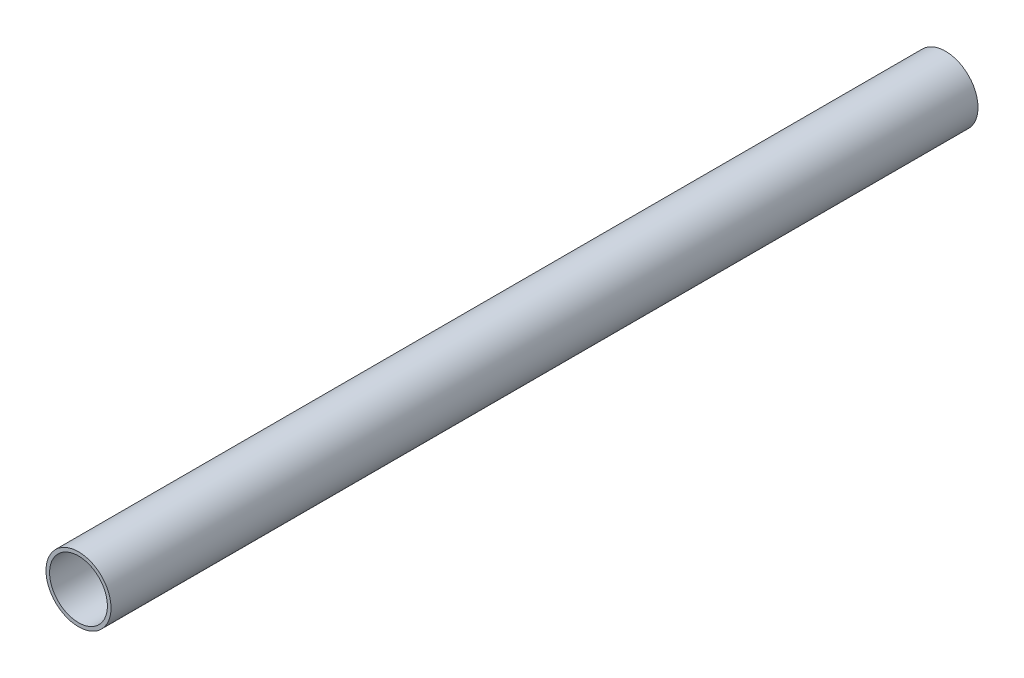
ISO-10303-21;
HEADER;
FILE_DESCRIPTION(('STEP AP214'),'2;1');
FILE_NAME('part.step','',(''),(''),'','','');
FILE_SCHEMA(('AUTOMOTIVE_DESIGN { 1 0 10303 214 1 1 1 1 }'));
ENDSEC;
DATA;
#1=APPLICATION_CONTEXT('core data for automotive mechanical design processes');
#2=APPLICATION_PROTOCOL_DEFINITION('international standard','automotive_design',2000,#1);
#3=PRODUCT_CONTEXT('',#1,'mechanical');
#4=PRODUCT('Part','Part','',(#3));
#5=PRODUCT_RELATED_PRODUCT_CATEGORY('part','',(#4));
#6=PRODUCT_DEFINITION_FORMATION('','',#4);
#7=PRODUCT_DEFINITION_CONTEXT('part definition',#1,'design');
#8=PRODUCT_DEFINITION('design','',#6,#7);
#9=PRODUCT_DEFINITION_SHAPE('','',#8);
#10=(LENGTH_UNIT() NAMED_UNIT(*) SI_UNIT(.MILLI.,.METRE.));
#11=(NAMED_UNIT(*) PLANE_ANGLE_UNIT() SI_UNIT($,.RADIAN.));
#12=(NAMED_UNIT(*) SI_UNIT($,.STERADIAN.) SOLID_ANGLE_UNIT());
#13=UNCERTAINTY_MEASURE_WITH_UNIT(LENGTH_MEASURE(1.E-05),#10,'distance_accuracy_value','');
#14=(GEOMETRIC_REPRESENTATION_CONTEXT(3) GLOBAL_UNCERTAINTY_ASSIGNED_CONTEXT((#13)) GLOBAL_UNIT_ASSIGNED_CONTEXT((#10,
#11,#12)) REPRESENTATION_CONTEXT('',''));
#15=CARTESIAN_POINT('',(0.,0.,0.));
#16=DIRECTION('',(0.,0.,1.));
#17=DIRECTION('',(1.,0.,0.));
#18=AXIS2_PLACEMENT_3D('',#15,#16,#17);
#19=CARTESIAN_POINT('',(0.,0.,0.));
#20=DIRECTION('',(0.,0.,-1.));
#21=DIRECTION('',(0.,-1.,0.));
#22=AXIS2_PLACEMENT_3D('',#19,#20,#21);
#23=CYLINDRICAL_SURFACE('',#22,16.9418);
#24=CARTESIAN_POINT('',(0.,0.,-508.));
#25=DIRECTION('',(0.,0.,1.));
#26=DIRECTION('',(1.,0.,0.));
#27=AXIS2_PLACEMENT_3D('',#24,#25,#26);
#28=CIRCLE('',#27,16.9418);
#29=CARTESIAN_POINT('',(16.9418,0.,-508.));
#30=VERTEX_POINT('',#29);
#31=EDGE_CURVE('E24',#30,#30,#28,.T.);
#32=ORIENTED_EDGE('',*,*,#31,.F.);
#33=EDGE_LOOP('',(#32));
#34=FACE_BOUND('',#33,.T.);
#35=CARTESIAN_POINT('',(0.,0.,0.));
#36=DIRECTION('',(0.,0.,-1.));
#37=DIRECTION('',(0.,-1.,0.));
#38=AXIS2_PLACEMENT_3D('',#35,#36,#37);
#39=CIRCLE('',#38,16.9418);
#40=CARTESIAN_POINT('',(0.,-16.9418,0.));
#41=VERTEX_POINT('',#40);
#42=EDGE_CURVE('E28',#41,#41,#39,.T.);
#43=ORIENTED_EDGE('',*,*,#42,.F.);
#44=EDGE_LOOP('',(#43));
#45=FACE_BOUND('',#44,.T.);
#46=ADVANCED_FACE('F14',(#34,#45),#23,.F.);
#47=CARTESIAN_POINT('',(0.,0.,0.));
#48=DIRECTION('',(0.,0.,-1.));
#49=DIRECTION('',(0.,-1.,0.));
#50=AXIS2_PLACEMENT_3D('',#47,#48,#49);
#51=CYLINDRICAL_SURFACE('',#50,19.05);
#52=CARTESIAN_POINT('',(0.,0.,-508.));
#53=DIRECTION('',(0.,0.,-1.));
#54=DIRECTION('',(0.,-1.,0.));
#55=AXIS2_PLACEMENT_3D('',#52,#53,#54);
#56=CIRCLE('',#55,19.05);
#57=CARTESIAN_POINT('',(0.,-19.05,-508.));
#58=VERTEX_POINT('',#57);
#59=EDGE_CURVE('E20',#58,#58,#56,.T.);
#60=ORIENTED_EDGE('',*,*,#59,.F.);
#61=EDGE_LOOP('',(#60));
#62=FACE_BOUND('',#61,.T.);
#63=CARTESIAN_POINT('',(0.,0.,0.));
#64=DIRECTION('',(0.,0.,-1.));
#65=DIRECTION('',(0.,-1.,0.));
#66=AXIS2_PLACEMENT_3D('',#63,#64,#65);
#67=CIRCLE('',#66,19.05);
#68=CARTESIAN_POINT('',(0.,-19.05,0.));
#69=VERTEX_POINT('',#68);
#70=EDGE_CURVE('E9',#69,#69,#67,.T.);
#71=ORIENTED_EDGE('',*,*,#70,.T.);
#72=EDGE_LOOP('',(#71));
#73=FACE_BOUND('',#72,.T.);
#74=ADVANCED_FACE('F37',(#62,#73),#51,.T.);
#75=CARTESIAN_POINT('',(0.,0.,-508.));
#76=DIRECTION('',(0.,0.,1.));
#77=DIRECTION('',(1.,0.,0.));
#78=AXIS2_PLACEMENT_3D('',#75,#76,#77);
#79=PLANE('',#78);
#80=ORIENTED_EDGE('',*,*,#59,.T.);
#81=EDGE_LOOP('',(#80));
#82=FACE_BOUND('',#81,.T.);
#83=ORIENTED_EDGE('',*,*,#31,.T.);
#84=EDGE_LOOP('',(#83));
#85=FACE_BOUND('',#84,.T.);
#86=ADVANCED_FACE('F43',(#82,#85),#79,.F.);
#87=CARTESIAN_POINT('',(0.,0.,0.));
#88=DIRECTION('',(0.,0.,1.));
#89=DIRECTION('',(1.,0.,0.));
#90=AXIS2_PLACEMENT_3D('',#87,#88,#89);
#91=PLANE('',#90);
#92=ORIENTED_EDGE('',*,*,#70,.F.);
#93=EDGE_LOOP('',(#92));
#94=FACE_BOUND('',#93,.T.);
#95=ORIENTED_EDGE('',*,*,#42,.T.);
#96=EDGE_LOOP('',(#95));
#97=FACE_BOUND('',#96,.T.);
#98=ADVANCED_FACE('F34',(#94,#97),#91,.T.);
#99=CLOSED_SHELL('',(#46,#74,#86,#98));
#100=MANIFOLD_SOLID_BREP('B1',#99);
#101=ADVANCED_BREP_SHAPE_REPRESENTATION('',(#18,#100),#14);
#102=SHAPE_DEFINITION_REPRESENTATION(#9,#101);
ENDSEC;
END-ISO-10303-21;
